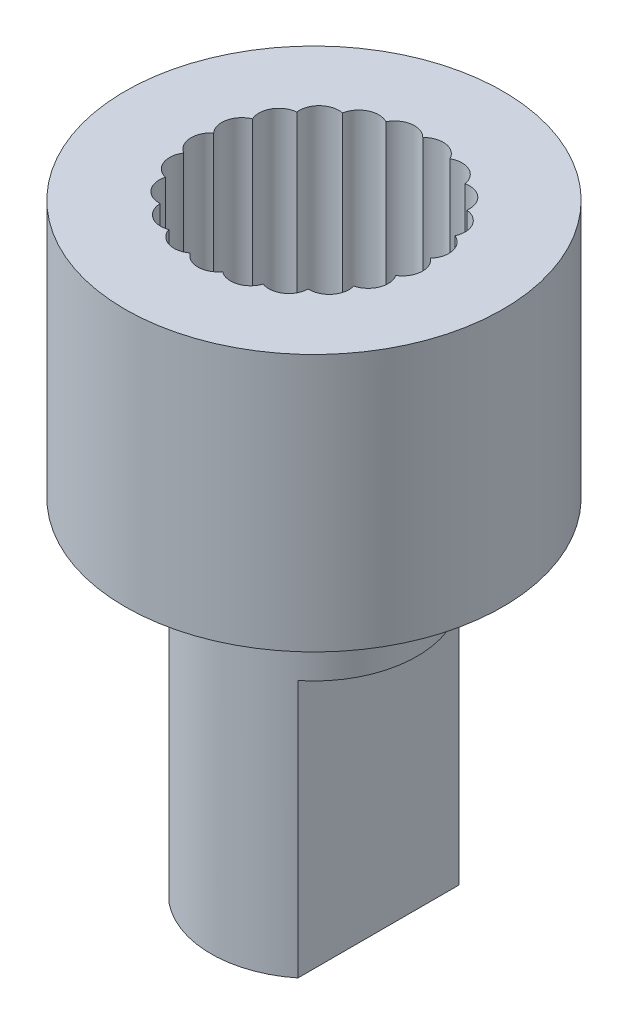
ISO-10303-21;
HEADER;
FILE_DESCRIPTION(('STEP AP214'),'2;1');
FILE_NAME('part.step','',(''),(''),'','','');
FILE_SCHEMA(('AUTOMOTIVE_DESIGN { 1 0 10303 214 1 1 1 1 }'));
ENDSEC;
DATA;
#1=APPLICATION_CONTEXT('core data for automotive mechanical design processes');
#2=APPLICATION_PROTOCOL_DEFINITION('international standard','automotive_design',2000,#1);
#3=PRODUCT_CONTEXT('',#1,'mechanical');
#4=PRODUCT('Part','Part','',(#3));
#5=PRODUCT_RELATED_PRODUCT_CATEGORY('part','',(#4));
#6=PRODUCT_DEFINITION_FORMATION('','',#4);
#7=PRODUCT_DEFINITION_CONTEXT('part definition',#1,'design');
#8=PRODUCT_DEFINITION('design','',#6,#7);
#9=PRODUCT_DEFINITION_SHAPE('','',#8);
#10=(LENGTH_UNIT() NAMED_UNIT(*) SI_UNIT(.MILLI.,.METRE.));
#11=(NAMED_UNIT(*) PLANE_ANGLE_UNIT() SI_UNIT($,.RADIAN.));
#12=(NAMED_UNIT(*) SI_UNIT($,.STERADIAN.) SOLID_ANGLE_UNIT());
#13=UNCERTAINTY_MEASURE_WITH_UNIT(LENGTH_MEASURE(1.E-05),#10,'distance_accuracy_value','');
#14=(GEOMETRIC_REPRESENTATION_CONTEXT(3) GLOBAL_UNCERTAINTY_ASSIGNED_CONTEXT((#13)) GLOBAL_UNIT_ASSIGNED_CONTEXT((#10,
#11,#12)) REPRESENTATION_CONTEXT('',''));
#15=CARTESIAN_POINT('',(0.,0.,0.));
#16=DIRECTION('',(0.,0.,1.));
#17=DIRECTION('',(1.,0.,0.));
#18=AXIS2_PLACEMENT_3D('',#15,#16,#17);
#19=CARTESIAN_POINT('',(0.,-4.,0.));
#20=DIRECTION('',(0.,-1.,0.));
#21=DIRECTION('',(0.,0.,-1.));
#22=AXIS2_PLACEMENT_3D('',#19,#20,#21);
#23=PLANE('',#22);
#24=CARTESIAN_POINT('',(0.,-4.,0.));
#25=DIRECTION('',(0.,-1.,0.));
#26=DIRECTION('',(0.,0.,-1.));
#27=AXIS2_PLACEMENT_3D('',#24,#25,#26);
#28=CIRCLE('',#27,2.4);
#29=CARTESIAN_POINT('',(1.5,-4.,-1.87349939951952));
#30=VERTEX_POINT('',#29);
#31=CARTESIAN_POINT('',(1.5,-4.,1.87349939951952));
#32=VERTEX_POINT('',#31);
#33=EDGE_CURVE('E483',#30,#32,#28,.T.);
#34=ORIENTED_EDGE('',*,*,#33,.T.);
#35=DIRECTION('',(0.,0.,-1.));
#36=VECTOR('',#35,1.);
#37=CARTESIAN_POINT('',(1.5,-4.,0.));
#38=LINE('',#37,#36);
#39=EDGE_CURVE('E450',#32,#30,#38,.T.);
#40=ORIENTED_EDGE('',*,*,#39,.T.);
#41=EDGE_LOOP('',(#34,#40));
#42=FACE_BOUND('',#41,.T.);
#43=ADVANCED_FACE('F41',(#42),#23,.T.);
#44=CARTESIAN_POINT('',(0.,-2.,0.));
#45=DIRECTION('',(0.,1.,0.));
#46=DIRECTION('',(0.,0.,1.));
#47=AXIS2_PLACEMENT_3D('',#44,#45,#46);
#48=CYLINDRICAL_SURFACE('',#47,4.4);
#49=CARTESIAN_POINT('',(0.,-2.,0.));
#50=DIRECTION('',(0.,-1.,0.));
#51=DIRECTION('',(0.,0.,-1.));
#52=AXIS2_PLACEMENT_3D('',#49,#50,#51);
#53=CIRCLE('',#52,4.4);
#54=CARTESIAN_POINT('',(0.,-2.,-4.4));
#55=VERTEX_POINT('',#54);
#56=EDGE_CURVE('E45',#55,#55,#53,.T.);
#57=ORIENTED_EDGE('',*,*,#56,.F.);
#58=EDGE_LOOP('',(#57));
#59=FACE_BOUND('',#58,.T.);
#60=CARTESIAN_POINT('',(0.,4.,0.));
#61=DIRECTION('',(0.,1.,0.));
#62=DIRECTION('',(0.,0.,1.));
#63=AXIS2_PLACEMENT_3D('',#60,#61,#62);
#64=CIRCLE('',#63,4.4);
#65=CARTESIAN_POINT('',(0.,4.,4.4));
#66=VERTEX_POINT('',#65);
#67=EDGE_CURVE('E390',#66,#66,#64,.T.);
#68=ORIENTED_EDGE('',*,*,#67,.F.);
#69=EDGE_LOOP('',(#68));
#70=FACE_BOUND('',#69,.T.);
#71=ADVANCED_FACE('F510',(#59,#70),#48,.T.);
#72=CARTESIAN_POINT('',(0.,-2.,0.));
#73=DIRECTION('',(0.,-1.,0.));
#74=DIRECTION('',(0.,0.,-1.));
#75=AXIS2_PLACEMENT_3D('',#72,#73,#74);
#76=PLANE('',#75);
#77=CARTESIAN_POINT('',(0.,-2.,0.));
#78=DIRECTION('',(0.,-1.,0.));
#79=DIRECTION('',(0.,0.,-1.));
#80=AXIS2_PLACEMENT_3D('',#77,#78,#79);
#81=CIRCLE('',#80,2.4);
#82=CARTESIAN_POINT('',(0.,-2.,-2.4));
#83=VERTEX_POINT('',#82);
#84=EDGE_CURVE('E11',#83,#83,#81,.T.);
#85=ORIENTED_EDGE('',*,*,#84,.F.);
#86=EDGE_LOOP('',(#85));
#87=FACE_BOUND('',#86,.T.);
#88=ORIENTED_EDGE('',*,*,#56,.T.);
#89=EDGE_LOOP('',(#88));
#90=FACE_BOUND('',#89,.T.);
#91=ADVANCED_FACE('F515',(#87,#90),#76,.T.);
#92=CARTESIAN_POINT('',(0.,-4.,0.));
#93=DIRECTION('',(0.,1.,0.));
#94=DIRECTION('',(0.,0.,1.));
#95=AXIS2_PLACEMENT_3D('',#92,#93,#94);
#96=CYLINDRICAL_SURFACE('',#95,2.4);
#97=ORIENTED_EDGE('',*,*,#33,.F.);
#98=DIRECTION('',(0.,1.,0.));
#99=VECTOR('',#98,1.);
#100=CARTESIAN_POINT('',(1.5,-10.,-1.87349939951952));
#101=LINE('',#100,#99);
#102=CARTESIAN_POINT('',(1.5,-10.,-1.87349939951952));
#103=VERTEX_POINT('',#102);
#104=EDGE_CURVE('E466',#103,#30,#101,.T.);
#105=ORIENTED_EDGE('',*,*,#104,.F.);
#106=CARTESIAN_POINT('',(0.,-10.,0.));
#107=DIRECTION('',(0.,-1.,0.));
#108=DIRECTION('',(0.,0.,-1.));
#109=AXIS2_PLACEMENT_3D('',#106,#107,#108);
#110=CIRCLE('',#109,2.4);
#111=CARTESIAN_POINT('',(-1.5,-10.,-1.87349939951952));
#112=VERTEX_POINT('',#111);
#113=EDGE_CURVE('E459',#112,#103,#110,.T.);
#114=ORIENTED_EDGE('',*,*,#113,.F.);
#115=DIRECTION('',(0.,1.,0.));
#116=VECTOR('',#115,1.);
#117=CARTESIAN_POINT('',(-1.5,-10.,-1.87349939951952));
#118=LINE('',#117,#116);
#119=CARTESIAN_POINT('',(-1.5,-4.,-1.87349939951952));
#120=VERTEX_POINT('',#119);
#121=EDGE_CURVE('E470',#112,#120,#118,.T.);
#122=ORIENTED_EDGE('',*,*,#121,.T.);
#123=CARTESIAN_POINT('',(-1.5,-4.,1.87349939951952));
#124=VERTEX_POINT('',#123);
#125=EDGE_CURVE('E482',#124,#120,#28,.T.);
#126=ORIENTED_EDGE('',*,*,#125,.F.);
#127=DIRECTION('',(0.,1.,0.));
#128=VECTOR('',#127,1.);
#129=CARTESIAN_POINT('',(-1.5,-10.,1.87349939951952));
#130=LINE('',#129,#128);
#131=CARTESIAN_POINT('',(-1.5,-10.,1.87349939951952));
#132=VERTEX_POINT('',#131);
#133=EDGE_CURVE('E474',#132,#124,#130,.T.);
#134=ORIENTED_EDGE('',*,*,#133,.F.);
#135=CARTESIAN_POINT('',(1.5,-10.,1.87349939951952));
#136=VERTEX_POINT('',#135);
#137=EDGE_CURVE('E455',#136,#132,#110,.T.);
#138=ORIENTED_EDGE('',*,*,#137,.F.);
#139=DIRECTION('',(0.,1.,0.));
#140=VECTOR('',#139,1.);
#141=CARTESIAN_POINT('',(1.5,-10.,1.87349939951952));
#142=LINE('',#141,#140);
#143=EDGE_CURVE('E478',#136,#32,#142,.T.);
#144=ORIENTED_EDGE('',*,*,#143,.T.);
#145=EDGE_LOOP('',(#97,#105,#114,#122,#126,#134,#138,#144));
#146=FACE_BOUND('',#145,.T.);
#147=ORIENTED_EDGE('',*,*,#84,.T.);
#148=EDGE_LOOP('',(#147));
#149=FACE_BOUND('',#148,.T.);
#150=ADVANCED_FACE('F498',(#146,#149),#96,.T.);
#151=DIRECTION('',(0.,0.,-1.));
#152=VECTOR('',#151,1.);
#153=CARTESIAN_POINT('',(-1.5,-4.,0.));
#154=LINE('',#153,#152);
#155=EDGE_CURVE('E64',#124,#120,#154,.T.);
#156=ORIENTED_EDGE('',*,*,#155,.F.);
#157=ORIENTED_EDGE('',*,*,#125,.T.);
#158=EDGE_LOOP('',(#156,#157));
#159=FACE_BOUND('',#158,.T.);
#160=ADVANCED_FACE('F490',(#159),#23,.T.);
#161=CARTESIAN_POINT('',(1.5,-10.,0.));
#162=DIRECTION('',(1.,0.,0.));
#163=DIRECTION('',(0.,0.,-1.));
#164=AXIS2_PLACEMENT_3D('',#161,#162,#163);
#165=PLANE('',#164);
#166=ORIENTED_EDGE('',*,*,#39,.F.);
#167=ORIENTED_EDGE('',*,*,#143,.F.);
#168=DIRECTION('',(0.,0.,-1.));
#169=VECTOR('',#168,1.);
#170=CARTESIAN_POINT('',(1.5,-10.,0.));
#171=LINE('',#170,#169);
#172=EDGE_CURVE('E451',#136,#103,#171,.T.);
#173=ORIENTED_EDGE('',*,*,#172,.T.);
#174=ORIENTED_EDGE('',*,*,#104,.T.);
#175=EDGE_LOOP('',(#166,#167,#173,#174));
#176=FACE_BOUND('',#175,.T.);
#177=ADVANCED_FACE('F508',(#176),#165,.T.);
#178=CARTESIAN_POINT('',(-1.5,-10.,0.));
#179=DIRECTION('',(1.,0.,0.));
#180=DIRECTION('',(0.,0.,-1.));
#181=AXIS2_PLACEMENT_3D('',#178,#179,#180);
#182=PLANE('',#181);
#183=ORIENTED_EDGE('',*,*,#155,.T.);
#184=ORIENTED_EDGE('',*,*,#121,.F.);
#185=DIRECTION('',(0.,0.,-1.));
#186=VECTOR('',#185,1.);
#187=CARTESIAN_POINT('',(-1.5,-10.,0.));
#188=LINE('',#187,#186);
#189=EDGE_CURVE('E458',#132,#112,#188,.T.);
#190=ORIENTED_EDGE('',*,*,#189,.F.);
#191=ORIENTED_EDGE('',*,*,#133,.T.);
#192=EDGE_LOOP('',(#183,#184,#190,#191));
#193=FACE_BOUND('',#192,.T.);
#194=ADVANCED_FACE('F495',(#193),#182,.F.);
#195=CARTESIAN_POINT('',(0.,-10.,0.));
#196=DIRECTION('',(0.,-1.,0.));
#197=DIRECTION('',(0.,0.,-1.));
#198=AXIS2_PLACEMENT_3D('',#195,#196,#197);
#199=PLANE('',#198);
#200=ORIENTED_EDGE('',*,*,#172,.F.);
#201=ORIENTED_EDGE('',*,*,#137,.T.);
#202=ORIENTED_EDGE('',*,*,#189,.T.);
#203=ORIENTED_EDGE('',*,*,#113,.T.);
#204=EDGE_LOOP('',(#200,#201,#202,#203));
#205=FACE_BOUND('',#204,.T.);
#206=ADVANCED_FACE('F504',(#205),#199,.T.);
#207=CARTESIAN_POINT('',(0.,4.,0.));
#208=DIRECTION('',(0.,1.,0.));
#209=DIRECTION('',(0.,0.,1.));
#210=AXIS2_PLACEMENT_3D('',#207,#208,#209);
#211=PLANE('',#210);
#212=CARTESIAN_POINT('',(2.18016592774031,4.,-0.497608646094468));
#213=DIRECTION('',(0.,1.,0.));
#214=DIRECTION('',(0.,0.,1.));
#215=AXIS2_PLACEMENT_3D('',#212,#213,#214);
#216=CIRCLE('',#215,0.463767043184508);
#217=CARTESIAN_POINT('',(2.52665455787561,4.,-0.189346583019778));
#218=VERTEX_POINT('',#217);
#219=CARTESIAN_POINT('',(2.35859150001944,4.,-0.925678950484961));
#220=VERTEX_POINT('',#219);
#221=EDGE_CURVE('E57',#218,#220,#216,.T.);
#222=ORIENTED_EDGE('',*,*,#221,.F.);
#223=CARTESIAN_POINT('',(2.2299799959181,4.,0.167113898143874));
#224=DIRECTION('',(0.,1.,0.));
#225=DIRECTION('',(0.,0.,1.));
#226=AXIS2_PLACEMENT_3D('',#223,#224,#225);
#227=CIRCLE('',#226,0.463767043184508);
#228=CARTESIAN_POINT('',(2.47021327022364,4.,0.563810059280507));
#229=VERTEX_POINT('',#228);
#230=EDGE_CURVE('E233',#229,#218,#227,.T.);
#231=ORIENTED_EDGE('',*,*,#230,.F.);
#232=CARTESIAN_POINT('',(2.08165055535255,4.,0.816987639164871));
#233=DIRECTION('',(0.,1.,0.));
#234=DIRECTION('',(0.,0.,1.));
#235=AXIS2_PLACEMENT_3D('',#232,#233,#234);
#236=CIRCLE('',#235,0.463767043184508);
#237=CARTESIAN_POINT('',(2.19428269315992,4.,1.26686970357403));
#238=VERTEX_POINT('',#237);
#239=EDGE_CURVE('E237',#238,#229,#236,.T.);
#240=ORIENTED_EDGE('',*,*,#239,.F.);
#241=CARTESIAN_POINT('',(1.74835732777092,4.,1.39426844315487));
#242=DIRECTION('',(0.,1.,0.));
#243=DIRECTION('',(0.,0.,1.));
#244=AXIS2_PLACEMENT_3D('',#241,#242,#243);
#245=CIRCLE('',#244,0.463767043184509);
#246=CARTESIAN_POINT('',(1.72338046935794,4.,1.85736241513887));
#247=VERTEX_POINT('',#246);
#248=EDGE_CURVE('E380',#247,#238,#245,.T.);
#249=ORIENTED_EDGE('',*,*,#248,.F.);
#250=CARTESIAN_POINT('',(1.25971487907708,4.,1.84766237732427));
#251=DIRECTION('',(0.,1.,0.));
#252=DIRECTION('',(0.,0.,1.));
#253=AXIS2_PLACEMENT_3D('',#250,#251,#252);
#254=CIRCLE('',#253,0.463767043184508);
#255=CARTESIAN_POINT('',(1.09934832792289,4.,2.28282032521792));
#256=VERTEX_POINT('',#255);
#257=EDGE_CURVE('E376',#256,#247,#254,.T.);
#258=ORIENTED_EDGE('',*,*,#257,.F.);
#259=CARTESIAN_POINT('',(0.659141235209555,4.,2.13688340093562));
#260=DIRECTION('',(0.,1.,0.));
#261=DIRECTION('',(0.,0.,1.));
#262=AXIS2_PLACEMENT_3D('',#259,#260,#261);
#263=CIRCLE('',#262,0.463767043184508);
#264=CARTESIAN_POINT('',(0.377634263141212,4.,2.50543963140936));
#265=VERTEX_POINT('',#264);
#266=EDGE_CURVE('E372',#265,#256,#263,.T.);
#267=ORIENTED_EDGE('',*,*,#266,.F.);
#268=CARTESIAN_POINT('',(0.,4.,2.2362329568155));
#269=DIRECTION('',(0.,1.,0.));
#270=DIRECTION('',(0.,0.,1.));
#271=AXIS2_PLACEMENT_3D('',#268,#269,#270);
#272=CIRCLE('',#271,0.463767043184508);
#273=CARTESIAN_POINT('',(-0.377634263141229,4.,2.50543963140936));
#274=VERTEX_POINT('',#273);
#275=EDGE_CURVE('E368',#274,#265,#272,.T.);
#276=ORIENTED_EDGE('',*,*,#275,.F.);
#277=CARTESIAN_POINT('',(-0.659141235209571,4.,2.13688340093562));
#278=DIRECTION('',(0.,1.,0.));
#279=DIRECTION('',(0.,0.,1.));
#280=AXIS2_PLACEMENT_3D('',#277,#278,#279);
#281=CIRCLE('',#280,0.463767043184508);
#282=CARTESIAN_POINT('',(-1.0993483279229,4.,2.28282032521791));
#283=VERTEX_POINT('',#282);
#284=EDGE_CURVE('E364',#283,#274,#281,.T.);
#285=ORIENTED_EDGE('',*,*,#284,.F.);
#286=CARTESIAN_POINT('',(-1.2597148790771,4.,1.84766237732427));
#287=DIRECTION('',(0.,1.,0.));
#288=DIRECTION('',(0.,0.,1.));
#289=AXIS2_PLACEMENT_3D('',#286,#287,#288);
#290=CIRCLE('',#289,0.463767043184508);
#291=CARTESIAN_POINT('',(-1.72338046935796,4.,1.85736241513886));
#292=VERTEX_POINT('',#291);
#293=EDGE_CURVE('E360',#292,#283,#290,.T.);
#294=ORIENTED_EDGE('',*,*,#293,.F.);
#295=CARTESIAN_POINT('',(-1.74835732777093,4.,1.39426844315486));
#296=DIRECTION('',(0.,1.,0.));
#297=DIRECTION('',(0.,0.,1.));
#298=AXIS2_PLACEMENT_3D('',#295,#296,#297);
#299=CIRCLE('',#298,0.463767043184508);
#300=CARTESIAN_POINT('',(-2.19428269315993,4.,1.26686970357402));
#301=VERTEX_POINT('',#300);
#302=EDGE_CURVE('E356',#301,#292,#299,.T.);
#303=ORIENTED_EDGE('',*,*,#302,.F.);
#304=CARTESIAN_POINT('',(-2.08165055535256,4.,0.816987639164863));
#305=DIRECTION('',(0.,1.,0.));
#306=DIRECTION('',(0.,0.,1.));
#307=AXIS2_PLACEMENT_3D('',#304,#305,#306);
#308=CIRCLE('',#307,0.463767043184509);
#309=CARTESIAN_POINT('',(-2.47021327022365,4.,0.563810059280497));
#310=VERTEX_POINT('',#309);
#311=EDGE_CURVE('E352',#310,#301,#308,.T.);
#312=ORIENTED_EDGE('',*,*,#311,.F.);
#313=CARTESIAN_POINT('',(-2.22997999591811,4.,0.167113898143865));
#314=DIRECTION('',(0.,1.,0.));
#315=DIRECTION('',(0.,0.,1.));
#316=AXIS2_PLACEMENT_3D('',#313,#314,#315);
#317=CIRCLE('',#316,0.463767043184508);
#318=CARTESIAN_POINT('',(-2.52665455787562,4.,-0.189346583019788));
#319=VERTEX_POINT('',#318);
#320=EDGE_CURVE('E348',#319,#310,#317,.T.);
#321=ORIENTED_EDGE('',*,*,#320,.F.);
#322=CARTESIAN_POINT('',(-2.18016592774032,4.,-0.497608646094477));
#323=DIRECTION('',(0.,1.,0.));
#324=DIRECTION('',(0.,0.,1.));
#325=AXIS2_PLACEMENT_3D('',#322,#323,#324);
#326=CIRCLE('',#325,0.463767043184508);
#327=CARTESIAN_POINT('',(-2.35859150001942,4.,-0.925678950484978));
#328=VERTEX_POINT('',#327);
#329=EDGE_CURVE('E344',#328,#319,#326,.T.);
#330=ORIENTED_EDGE('',*,*,#329,.F.);
#331=CARTESIAN_POINT('',(-1.93663454938219,4.,-1.11811647840777));
#332=DIRECTION('',(0.,1.,0.));
#333=DIRECTION('',(0.,0.,1.));
#334=AXIS2_PLACEMENT_3D('',#331,#332,#333);
#335=CIRCLE('',#334,0.463767043184513);
#336=CARTESIAN_POINT('',(-1.9809572368782,4.,-1.57976068092442));
#337=VERTEX_POINT('',#336);
#338=EDGE_CURVE('E340',#337,#328,#335,.T.);
#339=ORIENTED_EDGE('',*,*,#338,.F.);
#340=CARTESIAN_POINT('',(-1.52102469253073,4.,-1.63927475484116));
#341=DIRECTION('',(0.,1.,0.));
#342=DIRECTION('',(0.,0.,1.));
#343=AXIS2_PLACEMENT_3D('',#340,#341,#342);
#344=CIRCLE('',#343,0.463767043184508);
#345=CARTESIAN_POINT('',(-1.42730622995269,4.,-2.09347374219815));
#346=VERTEX_POINT('',#345);
#347=EDGE_CURVE('E336',#346,#337,#344,.T.);
#348=ORIENTED_EDGE('',*,*,#347,.F.);
#349=CARTESIAN_POINT('',(-0.970265116840991,4.,-2.01477627546815));
#350=DIRECTION('',(0.,1.,0.));
#351=DIRECTION('',(0.,0.,1.));
#352=AXIS2_PLACEMENT_3D('',#349,#350,#351);
#353=CIRCLE('',#352,0.463767043184509);
#354=CARTESIAN_POINT('',(-0.746832800865689,4.,-2.42117247441939));
#355=VERTEX_POINT('',#354);
#356=EDGE_CURVE('E332',#355,#346,#353,.T.);
#357=ORIENTED_EDGE('',*,*,#356,.F.);
#358=CARTESIAN_POINT('',(-0.333293227581628,4.,-2.21125608231973));
#359=DIRECTION('',(0.,1.,0.));
#360=DIRECTION('',(0.,0.,1.));
#361=AXIS2_PLACEMENT_3D('',#358,#359,#360);
#362=CIRCLE('',#361,0.463767043184508);
#363=CARTESIAN_POINT('',(0.,4.,-2.53373940714804));
#364=VERTEX_POINT('',#363);
#365=EDGE_CURVE('E328',#364,#355,#362,.T.);
#366=ORIENTED_EDGE('',*,*,#365,.F.);
#367=CARTESIAN_POINT('',(0.33329322758163,4.,-2.21125608231973));
#368=DIRECTION('',(0.,1.,0.));
#369=DIRECTION('',(0.,0.,1.));
#370=AXIS2_PLACEMENT_3D('',#367,#368,#369);
#371=CIRCLE('',#370,0.463767043184508);
#372=CARTESIAN_POINT('',(0.746832800865703,4.,-2.42117247441936));
#373=VERTEX_POINT('',#372);
#374=EDGE_CURVE('E324',#373,#364,#371,.T.);
#375=ORIENTED_EDGE('',*,*,#374,.F.);
#376=CARTESIAN_POINT('',(0.970265116841022,4.,-2.01477627546813));
#377=DIRECTION('',(0.,1.,0.));
#378=DIRECTION('',(0.,0.,1.));
#379=AXIS2_PLACEMENT_3D('',#376,#377,#378);
#380=CIRCLE('',#379,0.463767043184508);
#381=CARTESIAN_POINT('',(1.42730622995272,4.,-2.09347374219813));
#382=VERTEX_POINT('',#381);
#383=EDGE_CURVE('E320',#382,#373,#380,.T.);
#384=ORIENTED_EDGE('',*,*,#383,.F.);
#385=CARTESIAN_POINT('',(1.52102469253075,4.,-1.63927475484114));
#386=DIRECTION('',(0.,1.,0.));
#387=DIRECTION('',(0.,0.,1.));
#388=AXIS2_PLACEMENT_3D('',#385,#386,#387);
#389=CIRCLE('',#388,0.463767043184509);
#390=CARTESIAN_POINT('',(1.98095723687822,4.,-1.57976068092439));
#391=VERTEX_POINT('',#390);
#392=EDGE_CURVE('E316',#391,#382,#389,.T.);
#393=ORIENTED_EDGE('',*,*,#392,.F.);
#394=CARTESIAN_POINT('',(1.93663454938221,4.,-1.11811647840774));
#395=DIRECTION('',(0.,1.,0.));
#396=DIRECTION('',(0.,0.,1.));
#397=AXIS2_PLACEMENT_3D('',#394,#395,#396);
#398=CIRCLE('',#397,0.463767043184508);
#399=EDGE_CURVE('E313',#220,#391,#398,.T.);
#400=ORIENTED_EDGE('',*,*,#399,.F.);
#401=EDGE_LOOP('',(#222,#231,#240,#249,#258,#267,#276,#285,#294,#303,#312,#321,#330,#339,#348,
#357,#366,#375,#384,#393,#400));
#402=FACE_BOUND('',#401,.T.);
#403=ORIENTED_EDGE('',*,*,#67,.T.);
#404=EDGE_LOOP('',(#403));
#405=FACE_BOUND('',#404,.T.);
#406=ADVANCED_FACE('F43',(#402,#405),#211,.T.);
#407=CARTESIAN_POINT('',(2.18016592774031,0.,-0.497608646094468));
#408=DIRECTION('',(0.,1.,0.));
#409=DIRECTION('',(0.,0.,1.));
#410=AXIS2_PLACEMENT_3D('',#407,#408,#409);
#411=CYLINDRICAL_SURFACE('',#410,0.463767043184508);
#412=ORIENTED_EDGE('',*,*,#221,.T.);
#413=DIRECTION('',(0.,1.,0.));
#414=VECTOR('',#413,1.);
#415=CARTESIAN_POINT('',(2.35859150001944,0.,-0.925678950484961));
#416=LINE('',#415,#414);
#417=CARTESIAN_POINT('',(2.35859150001944,0.,-0.925678950484961));
#418=VERTEX_POINT('',#417);
#419=EDGE_CURVE('E207',#418,#220,#416,.T.);
#420=ORIENTED_EDGE('',*,*,#419,.F.);
#421=CARTESIAN_POINT('',(2.18016592774031,0.,-0.497608646094468));
#422=DIRECTION('',(0.,1.,0.));
#423=DIRECTION('',(0.,0.,1.));
#424=AXIS2_PLACEMENT_3D('',#421,#422,#423);
#425=CIRCLE('',#424,0.463767043184508);
#426=CARTESIAN_POINT('',(2.52665455787561,0.,-0.189346583019778));
#427=VERTEX_POINT('',#426);
#428=EDGE_CURVE('E211',#427,#418,#425,.T.);
#429=ORIENTED_EDGE('',*,*,#428,.F.);
#430=DIRECTION('',(0.,1.,0.));
#431=VECTOR('',#430,1.);
#432=CARTESIAN_POINT('',(2.52665455787561,0.,-0.189346583019778));
#433=LINE('',#432,#431);
#434=EDGE_CURVE('E387',#427,#218,#433,.T.);
#435=ORIENTED_EDGE('',*,*,#434,.T.);
#436=EDGE_LOOP('',(#412,#420,#429,#435));
#437=FACE_BOUND('',#436,.T.);
#438=ADVANCED_FACE('F209',(#437),#411,.F.);
#439=CARTESIAN_POINT('',(2.2299799959181,0.,0.167113898143874));
#440=DIRECTION('',(0.,1.,0.));
#441=DIRECTION('',(0.,0.,1.));
#442=AXIS2_PLACEMENT_3D('',#439,#440,#441);
#443=CYLINDRICAL_SURFACE('',#442,0.463767043184508);
#444=ORIENTED_EDGE('',*,*,#230,.T.);
#445=ORIENTED_EDGE('',*,*,#434,.F.);
#446=CARTESIAN_POINT('',(2.2299799959181,0.,0.167113898143874));
#447=DIRECTION('',(0.,1.,0.));
#448=DIRECTION('',(0.,0.,1.));
#449=AXIS2_PLACEMENT_3D('',#446,#447,#448);
#450=CIRCLE('',#449,0.463767043184508);
#451=CARTESIAN_POINT('',(2.47021327022364,0.,0.563810059280507));
#452=VERTEX_POINT('',#451);
#453=EDGE_CURVE('E218',#452,#427,#450,.T.);
#454=ORIENTED_EDGE('',*,*,#453,.F.);
#455=DIRECTION('',(0.,1.,0.));
#456=VECTOR('',#455,1.);
#457=CARTESIAN_POINT('',(2.47021327022364,0.,0.563810059280507));
#458=LINE('',#457,#456);
#459=EDGE_CURVE('E391',#452,#229,#458,.T.);
#460=ORIENTED_EDGE('',*,*,#459,.T.);
#461=EDGE_LOOP('',(#444,#445,#454,#460));
#462=FACE_BOUND('',#461,.T.);
#463=ADVANCED_FACE('F546',(#462),#443,.F.);
#464=CARTESIAN_POINT('',(2.08165055535255,0.,0.816987639164871));
#465=DIRECTION('',(0.,1.,0.));
#466=DIRECTION('',(0.,0.,1.));
#467=AXIS2_PLACEMENT_3D('',#464,#465,#466);
#468=CYLINDRICAL_SURFACE('',#467,0.463767043184508);
#469=ORIENTED_EDGE('',*,*,#239,.T.);
#470=ORIENTED_EDGE('',*,*,#459,.F.);
#471=CARTESIAN_POINT('',(2.08165055535255,0.,0.816987639164871));
#472=DIRECTION('',(0.,1.,0.));
#473=DIRECTION('',(0.,0.,1.));
#474=AXIS2_PLACEMENT_3D('',#471,#472,#473);
#475=CIRCLE('',#474,0.463767043184508);
#476=CARTESIAN_POINT('',(2.19428269315992,0.,1.26686970357403));
#477=VERTEX_POINT('',#476);
#478=EDGE_CURVE('E306',#477,#452,#475,.T.);
#479=ORIENTED_EDGE('',*,*,#478,.F.);
#480=DIRECTION('',(0.,1.,0.));
#481=VECTOR('',#480,1.);
#482=CARTESIAN_POINT('',(2.19428269315992,0.,1.26686970357403));
#483=LINE('',#482,#481);
#484=EDGE_CURVE('E394',#477,#238,#483,.T.);
#485=ORIENTED_EDGE('',*,*,#484,.T.);
#486=EDGE_LOOP('',(#469,#470,#479,#485));
#487=FACE_BOUND('',#486,.T.);
#488=ADVANCED_FACE('F575',(#487),#468,.F.);
#489=CARTESIAN_POINT('',(1.74835732777092,0.,1.39426844315487));
#490=DIRECTION('',(0.,1.,0.));
#491=DIRECTION('',(0.,0.,1.));
#492=AXIS2_PLACEMENT_3D('',#489,#490,#491);
#493=CYLINDRICAL_SURFACE('',#492,0.463767043184509);
#494=ORIENTED_EDGE('',*,*,#248,.T.);
#495=ORIENTED_EDGE('',*,*,#484,.F.);
#496=CARTESIAN_POINT('',(1.74835732777092,0.,1.39426844315487));
#497=DIRECTION('',(0.,1.,0.));
#498=DIRECTION('',(0.,0.,1.));
#499=AXIS2_PLACEMENT_3D('',#496,#497,#498);
#500=CIRCLE('',#499,0.463767043184509);
#501=CARTESIAN_POINT('',(1.72338046935794,0.,1.85736241513887));
#502=VERTEX_POINT('',#501);
#503=EDGE_CURVE('E302',#502,#477,#500,.T.);
#504=ORIENTED_EDGE('',*,*,#503,.F.);
#505=DIRECTION('',(0.,1.,0.));
#506=VECTOR('',#505,1.);
#507=CARTESIAN_POINT('',(1.72338046935794,0.,1.85736241513887));
#508=LINE('',#507,#506);
#509=EDGE_CURVE('E397',#502,#247,#508,.T.);
#510=ORIENTED_EDGE('',*,*,#509,.T.);
#511=EDGE_LOOP('',(#494,#495,#504,#510));
#512=FACE_BOUND('',#511,.T.);
#513=ADVANCED_FACE('F583',(#512),#493,.F.);
#514=CARTESIAN_POINT('',(1.25971487907708,0.,1.84766237732427));
#515=DIRECTION('',(0.,1.,0.));
#516=DIRECTION('',(0.,0.,1.));
#517=AXIS2_PLACEMENT_3D('',#514,#515,#516);
#518=CYLINDRICAL_SURFACE('',#517,0.463767043184508);
#519=ORIENTED_EDGE('',*,*,#257,.T.);
#520=ORIENTED_EDGE('',*,*,#509,.F.);
#521=CARTESIAN_POINT('',(1.25971487907708,0.,1.84766237732427));
#522=DIRECTION('',(0.,1.,0.));
#523=DIRECTION('',(0.,0.,1.));
#524=AXIS2_PLACEMENT_3D('',#521,#522,#523);
#525=CIRCLE('',#524,0.463767043184508);
#526=CARTESIAN_POINT('',(1.09934832792289,0.,2.28282032521792));
#527=VERTEX_POINT('',#526);
#528=EDGE_CURVE('E298',#527,#502,#525,.T.);
#529=ORIENTED_EDGE('',*,*,#528,.F.);
#530=DIRECTION('',(0.,1.,0.));
#531=VECTOR('',#530,1.);
#532=CARTESIAN_POINT('',(1.09934832792289,0.,2.28282032521792));
#533=LINE('',#532,#531);
#534=EDGE_CURVE('E400',#527,#256,#533,.T.);
#535=ORIENTED_EDGE('',*,*,#534,.T.);
#536=EDGE_LOOP('',(#519,#520,#529,#535));
#537=FACE_BOUND('',#536,.T.);
#538=ADVANCED_FACE('F591',(#537),#518,.F.);
#539=CARTESIAN_POINT('',(0.659141235209555,0.,2.13688340093562));
#540=DIRECTION('',(0.,1.,0.));
#541=DIRECTION('',(0.,0.,1.));
#542=AXIS2_PLACEMENT_3D('',#539,#540,#541);
#543=CYLINDRICAL_SURFACE('',#542,0.463767043184508);
#544=ORIENTED_EDGE('',*,*,#266,.T.);
#545=ORIENTED_EDGE('',*,*,#534,.F.);
#546=CARTESIAN_POINT('',(0.659141235209555,0.,2.13688340093562));
#547=DIRECTION('',(0.,1.,0.));
#548=DIRECTION('',(0.,0.,1.));
#549=AXIS2_PLACEMENT_3D('',#546,#547,#548);
#550=CIRCLE('',#549,0.463767043184508);
#551=CARTESIAN_POINT('',(0.377634263141212,0.,2.50543963140936));
#552=VERTEX_POINT('',#551);
#553=EDGE_CURVE('E294',#552,#527,#550,.T.);
#554=ORIENTED_EDGE('',*,*,#553,.F.);
#555=DIRECTION('',(0.,1.,0.));
#556=VECTOR('',#555,1.);
#557=CARTESIAN_POINT('',(0.377634263141212,0.,2.50543963140936));
#558=LINE('',#557,#556);
#559=EDGE_CURVE('E403',#552,#265,#558,.T.);
#560=ORIENTED_EDGE('',*,*,#559,.T.);
#561=EDGE_LOOP('',(#544,#545,#554,#560));
#562=FACE_BOUND('',#561,.T.);
#563=ADVANCED_FACE('F599',(#562),#543,.F.);
#564=CARTESIAN_POINT('',(0.,0.,2.2362329568155));
#565=DIRECTION('',(0.,1.,0.));
#566=DIRECTION('',(0.,0.,1.));
#567=AXIS2_PLACEMENT_3D('',#564,#565,#566);
#568=CYLINDRICAL_SURFACE('',#567,0.463767043184508);
#569=ORIENTED_EDGE('',*,*,#275,.T.);
#570=ORIENTED_EDGE('',*,*,#559,.F.);
#571=CARTESIAN_POINT('',(0.,0.,2.2362329568155));
#572=DIRECTION('',(0.,1.,0.));
#573=DIRECTION('',(0.,0.,1.));
#574=AXIS2_PLACEMENT_3D('',#571,#572,#573);
#575=CIRCLE('',#574,0.463767043184508);
#576=CARTESIAN_POINT('',(-0.377634263141229,0.,2.50543963140936));
#577=VERTEX_POINT('',#576);
#578=EDGE_CURVE('E290',#577,#552,#575,.T.);
#579=ORIENTED_EDGE('',*,*,#578,.F.);
#580=DIRECTION('',(0.,1.,0.));
#581=VECTOR('',#580,1.);
#582=CARTESIAN_POINT('',(-0.377634263141229,0.,2.50543963140936));
#583=LINE('',#582,#581);
#584=EDGE_CURVE('E406',#577,#274,#583,.T.);
#585=ORIENTED_EDGE('',*,*,#584,.T.);
#586=EDGE_LOOP('',(#569,#570,#579,#585));
#587=FACE_BOUND('',#586,.T.);
#588=ADVANCED_FACE('F607',(#587),#568,.F.);
#589=CARTESIAN_POINT('',(-0.659141235209571,0.,2.13688340093562));
#590=DIRECTION('',(0.,1.,0.));
#591=DIRECTION('',(0.,0.,1.));
#592=AXIS2_PLACEMENT_3D('',#589,#590,#591);
#593=CYLINDRICAL_SURFACE('',#592,0.463767043184508);
#594=ORIENTED_EDGE('',*,*,#284,.T.);
#595=ORIENTED_EDGE('',*,*,#584,.F.);
#596=CARTESIAN_POINT('',(-0.659141235209571,0.,2.13688340093562));
#597=DIRECTION('',(0.,1.,0.));
#598=DIRECTION('',(0.,0.,1.));
#599=AXIS2_PLACEMENT_3D('',#596,#597,#598);
#600=CIRCLE('',#599,0.463767043184508);
#601=CARTESIAN_POINT('',(-1.0993483279229,0.,2.28282032521791));
#602=VERTEX_POINT('',#601);
#603=EDGE_CURVE('E286',#602,#577,#600,.T.);
#604=ORIENTED_EDGE('',*,*,#603,.F.);
#605=DIRECTION('',(0.,1.,0.));
#606=VECTOR('',#605,1.);
#607=CARTESIAN_POINT('',(-1.0993483279229,0.,2.28282032521791));
#608=LINE('',#607,#606);
#609=EDGE_CURVE('E409',#602,#283,#608,.T.);
#610=ORIENTED_EDGE('',*,*,#609,.T.);
#611=EDGE_LOOP('',(#594,#595,#604,#610));
#612=FACE_BOUND('',#611,.T.);
#613=ADVANCED_FACE('F615',(#612),#593,.F.);
#614=CARTESIAN_POINT('',(-1.2597148790771,0.,1.84766237732427));
#615=DIRECTION('',(0.,1.,0.));
#616=DIRECTION('',(0.,0.,1.));
#617=AXIS2_PLACEMENT_3D('',#614,#615,#616);
#618=CYLINDRICAL_SURFACE('',#617,0.463767043184508);
#619=ORIENTED_EDGE('',*,*,#293,.T.);
#620=ORIENTED_EDGE('',*,*,#609,.F.);
#621=CARTESIAN_POINT('',(-1.2597148790771,0.,1.84766237732427));
#622=DIRECTION('',(0.,1.,0.));
#623=DIRECTION('',(0.,0.,1.));
#624=AXIS2_PLACEMENT_3D('',#621,#622,#623);
#625=CIRCLE('',#624,0.463767043184508);
#626=CARTESIAN_POINT('',(-1.72338046935796,0.,1.85736241513886));
#627=VERTEX_POINT('',#626);
#628=EDGE_CURVE('E282',#627,#602,#625,.T.);
#629=ORIENTED_EDGE('',*,*,#628,.F.);
#630=DIRECTION('',(0.,1.,0.));
#631=VECTOR('',#630,1.);
#632=CARTESIAN_POINT('',(-1.72338046935796,0.,1.85736241513886));
#633=LINE('',#632,#631);
#634=EDGE_CURVE('E412',#627,#292,#633,.T.);
#635=ORIENTED_EDGE('',*,*,#634,.T.);
#636=EDGE_LOOP('',(#619,#620,#629,#635));
#637=FACE_BOUND('',#636,.T.);
#638=ADVANCED_FACE('F623',(#637),#618,.F.);
#639=CARTESIAN_POINT('',(-1.74835732777093,0.,1.39426844315486));
#640=DIRECTION('',(0.,1.,0.));
#641=DIRECTION('',(0.,0.,1.));
#642=AXIS2_PLACEMENT_3D('',#639,#640,#641);
#643=CYLINDRICAL_SURFACE('',#642,0.463767043184508);
#644=ORIENTED_EDGE('',*,*,#302,.T.);
#645=ORIENTED_EDGE('',*,*,#634,.F.);
#646=CARTESIAN_POINT('',(-1.74835732777093,0.,1.39426844315486));
#647=DIRECTION('',(0.,1.,0.));
#648=DIRECTION('',(0.,0.,1.));
#649=AXIS2_PLACEMENT_3D('',#646,#647,#648);
#650=CIRCLE('',#649,0.463767043184508);
#651=CARTESIAN_POINT('',(-2.19428269315993,0.,1.26686970357402));
#652=VERTEX_POINT('',#651);
#653=EDGE_CURVE('E278',#652,#627,#650,.T.);
#654=ORIENTED_EDGE('',*,*,#653,.F.);
#655=DIRECTION('',(0.,1.,0.));
#656=VECTOR('',#655,1.);
#657=CARTESIAN_POINT('',(-2.19428269315993,0.,1.26686970357402));
#658=LINE('',#657,#656);
#659=EDGE_CURVE('E415',#652,#301,#658,.T.);
#660=ORIENTED_EDGE('',*,*,#659,.T.);
#661=EDGE_LOOP('',(#644,#645,#654,#660));
#662=FACE_BOUND('',#661,.T.);
#663=ADVANCED_FACE('F631',(#662),#643,.F.);
#664=CARTESIAN_POINT('',(-2.08165055535256,0.,0.816987639164863));
#665=DIRECTION('',(0.,1.,0.));
#666=DIRECTION('',(0.,0.,1.));
#667=AXIS2_PLACEMENT_3D('',#664,#665,#666);
#668=CYLINDRICAL_SURFACE('',#667,0.463767043184509);
#669=ORIENTED_EDGE('',*,*,#311,.T.);
#670=ORIENTED_EDGE('',*,*,#659,.F.);
#671=CARTESIAN_POINT('',(-2.08165055535256,0.,0.816987639164863));
#672=DIRECTION('',(0.,1.,0.));
#673=DIRECTION('',(0.,0.,1.));
#674=AXIS2_PLACEMENT_3D('',#671,#672,#673);
#675=CIRCLE('',#674,0.463767043184509);
#676=CARTESIAN_POINT('',(-2.47021327022365,0.,0.563810059280497));
#677=VERTEX_POINT('',#676);
#678=EDGE_CURVE('E274',#677,#652,#675,.T.);
#679=ORIENTED_EDGE('',*,*,#678,.F.);
#680=DIRECTION('',(0.,1.,0.));
#681=VECTOR('',#680,1.);
#682=CARTESIAN_POINT('',(-2.47021327022365,0.,0.563810059280497));
#683=LINE('',#682,#681);
#684=EDGE_CURVE('E418',#677,#310,#683,.T.);
#685=ORIENTED_EDGE('',*,*,#684,.T.);
#686=EDGE_LOOP('',(#669,#670,#679,#685));
#687=FACE_BOUND('',#686,.T.);
#688=ADVANCED_FACE('F639',(#687),#668,.F.);
#689=CARTESIAN_POINT('',(-2.22997999591811,0.,0.167113898143865));
#690=DIRECTION('',(0.,1.,0.));
#691=DIRECTION('',(0.,0.,1.));
#692=AXIS2_PLACEMENT_3D('',#689,#690,#691);
#693=CYLINDRICAL_SURFACE('',#692,0.463767043184508);
#694=ORIENTED_EDGE('',*,*,#320,.T.);
#695=ORIENTED_EDGE('',*,*,#684,.F.);
#696=CARTESIAN_POINT('',(-2.22997999591811,0.,0.167113898143865));
#697=DIRECTION('',(0.,1.,0.));
#698=DIRECTION('',(0.,0.,1.));
#699=AXIS2_PLACEMENT_3D('',#696,#697,#698);
#700=CIRCLE('',#699,0.463767043184508);
#701=CARTESIAN_POINT('',(-2.52665455787562,0.,-0.189346583019788));
#702=VERTEX_POINT('',#701);
#703=EDGE_CURVE('E270',#702,#677,#700,.T.);
#704=ORIENTED_EDGE('',*,*,#703,.F.);
#705=DIRECTION('',(0.,1.,0.));
#706=VECTOR('',#705,1.);
#707=CARTESIAN_POINT('',(-2.52665455787562,0.,-0.189346583019788));
#708=LINE('',#707,#706);
#709=EDGE_CURVE('E421',#702,#319,#708,.T.);
#710=ORIENTED_EDGE('',*,*,#709,.T.);
#711=EDGE_LOOP('',(#694,#695,#704,#710));
#712=FACE_BOUND('',#711,.T.);
#713=ADVANCED_FACE('F647',(#712),#693,.F.);
#714=CARTESIAN_POINT('',(-2.18016592774032,0.,-0.497608646094477));
#715=DIRECTION('',(0.,1.,0.));
#716=DIRECTION('',(0.,0.,1.));
#717=AXIS2_PLACEMENT_3D('',#714,#715,#716);
#718=CYLINDRICAL_SURFACE('',#717,0.463767043184508);
#719=ORIENTED_EDGE('',*,*,#329,.T.);
#720=ORIENTED_EDGE('',*,*,#709,.F.);
#721=CARTESIAN_POINT('',(-2.18016592774032,0.,-0.497608646094477));
#722=DIRECTION('',(0.,1.,0.));
#723=DIRECTION('',(0.,0.,1.));
#724=AXIS2_PLACEMENT_3D('',#721,#722,#723);
#725=CIRCLE('',#724,0.463767043184508);
#726=CARTESIAN_POINT('',(-2.35859150001942,0.,-0.925678950484978));
#727=VERTEX_POINT('',#726);
#728=EDGE_CURVE('E266',#727,#702,#725,.T.);
#729=ORIENTED_EDGE('',*,*,#728,.F.);
#730=DIRECTION('',(0.,1.,0.));
#731=VECTOR('',#730,1.);
#732=CARTESIAN_POINT('',(-2.35859150001942,0.,-0.925678950484978));
#733=LINE('',#732,#731);
#734=EDGE_CURVE('E424',#727,#328,#733,.T.);
#735=ORIENTED_EDGE('',*,*,#734,.T.);
#736=EDGE_LOOP('',(#719,#720,#729,#735));
#737=FACE_BOUND('',#736,.T.);
#738=ADVANCED_FACE('F655',(#737),#718,.F.);
#739=CARTESIAN_POINT('',(-1.93663454938219,0.,-1.11811647840777));
#740=DIRECTION('',(0.,1.,0.));
#741=DIRECTION('',(0.,0.,1.));
#742=AXIS2_PLACEMENT_3D('',#739,#740,#741);
#743=CYLINDRICAL_SURFACE('',#742,0.463767043184513);
#744=ORIENTED_EDGE('',*,*,#338,.T.);
#745=ORIENTED_EDGE('',*,*,#734,.F.);
#746=CARTESIAN_POINT('',(-1.93663454938219,0.,-1.11811647840777));
#747=DIRECTION('',(0.,1.,0.));
#748=DIRECTION('',(0.,0.,1.));
#749=AXIS2_PLACEMENT_3D('',#746,#747,#748);
#750=CIRCLE('',#749,0.463767043184513);
#751=CARTESIAN_POINT('',(-1.9809572368782,0.,-1.57976068092442));
#752=VERTEX_POINT('',#751);
#753=EDGE_CURVE('E262',#752,#727,#750,.T.);
#754=ORIENTED_EDGE('',*,*,#753,.F.);
#755=DIRECTION('',(0.,1.,0.));
#756=VECTOR('',#755,1.);
#757=CARTESIAN_POINT('',(-1.9809572368782,0.,-1.57976068092442));
#758=LINE('',#757,#756);
#759=EDGE_CURVE('E427',#752,#337,#758,.T.);
#760=ORIENTED_EDGE('',*,*,#759,.T.);
#761=EDGE_LOOP('',(#744,#745,#754,#760));
#762=FACE_BOUND('',#761,.T.);
#763=ADVANCED_FACE('F663',(#762),#743,.F.);
#764=CARTESIAN_POINT('',(-1.52102469253073,0.,-1.63927475484116));
#765=DIRECTION('',(0.,1.,0.));
#766=DIRECTION('',(0.,0.,1.));
#767=AXIS2_PLACEMENT_3D('',#764,#765,#766);
#768=CYLINDRICAL_SURFACE('',#767,0.463767043184508);
#769=ORIENTED_EDGE('',*,*,#347,.T.);
#770=ORIENTED_EDGE('',*,*,#759,.F.);
#771=CARTESIAN_POINT('',(-1.52102469253073,0.,-1.63927475484116));
#772=DIRECTION('',(0.,1.,0.));
#773=DIRECTION('',(0.,0.,1.));
#774=AXIS2_PLACEMENT_3D('',#771,#772,#773);
#775=CIRCLE('',#774,0.463767043184508);
#776=CARTESIAN_POINT('',(-1.42730622995269,0.,-2.09347374219815));
#777=VERTEX_POINT('',#776);
#778=EDGE_CURVE('E258',#777,#752,#775,.T.);
#779=ORIENTED_EDGE('',*,*,#778,.F.);
#780=DIRECTION('',(0.,1.,0.));
#781=VECTOR('',#780,1.);
#782=CARTESIAN_POINT('',(-1.42730622995269,0.,-2.09347374219815));
#783=LINE('',#782,#781);
#784=EDGE_CURVE('E430',#777,#346,#783,.T.);
#785=ORIENTED_EDGE('',*,*,#784,.T.);
#786=EDGE_LOOP('',(#769,#770,#779,#785));
#787=FACE_BOUND('',#786,.T.);
#788=ADVANCED_FACE('F671',(#787),#768,.F.);
#789=CARTESIAN_POINT('',(-0.970265116840991,0.,-2.01477627546815));
#790=DIRECTION('',(0.,1.,0.));
#791=DIRECTION('',(0.,0.,1.));
#792=AXIS2_PLACEMENT_3D('',#789,#790,#791);
#793=CYLINDRICAL_SURFACE('',#792,0.463767043184509);
#794=ORIENTED_EDGE('',*,*,#356,.T.);
#795=ORIENTED_EDGE('',*,*,#784,.F.);
#796=CARTESIAN_POINT('',(-0.970265116840991,0.,-2.01477627546815));
#797=DIRECTION('',(0.,1.,0.));
#798=DIRECTION('',(0.,0.,1.));
#799=AXIS2_PLACEMENT_3D('',#796,#797,#798);
#800=CIRCLE('',#799,0.463767043184509);
#801=CARTESIAN_POINT('',(-0.746832800865689,0.,-2.42117247441939));
#802=VERTEX_POINT('',#801);
#803=EDGE_CURVE('E254',#802,#777,#800,.T.);
#804=ORIENTED_EDGE('',*,*,#803,.F.);
#805=DIRECTION('',(0.,1.,0.));
#806=VECTOR('',#805,1.);
#807=CARTESIAN_POINT('',(-0.746832800865689,0.,-2.42117247441939));
#808=LINE('',#807,#806);
#809=EDGE_CURVE('E433',#802,#355,#808,.T.);
#810=ORIENTED_EDGE('',*,*,#809,.T.);
#811=EDGE_LOOP('',(#794,#795,#804,#810));
#812=FACE_BOUND('',#811,.T.);
#813=ADVANCED_FACE('F679',(#812),#793,.F.);
#814=CARTESIAN_POINT('',(-0.333293227581628,0.,-2.21125608231973));
#815=DIRECTION('',(0.,1.,0.));
#816=DIRECTION('',(0.,0.,1.));
#817=AXIS2_PLACEMENT_3D('',#814,#815,#816);
#818=CYLINDRICAL_SURFACE('',#817,0.463767043184508);
#819=ORIENTED_EDGE('',*,*,#365,.T.);
#820=ORIENTED_EDGE('',*,*,#809,.F.);
#821=CARTESIAN_POINT('',(-0.333293227581628,0.,-2.21125608231973));
#822=DIRECTION('',(0.,1.,0.));
#823=DIRECTION('',(0.,0.,1.));
#824=AXIS2_PLACEMENT_3D('',#821,#822,#823);
#825=CIRCLE('',#824,0.463767043184508);
#826=CARTESIAN_POINT('',(0.,0.,-2.53373940714804));
#827=VERTEX_POINT('',#826);
#828=EDGE_CURVE('E250',#827,#802,#825,.T.);
#829=ORIENTED_EDGE('',*,*,#828,.F.);
#830=DIRECTION('',(0.,1.,0.));
#831=VECTOR('',#830,1.);
#832=CARTESIAN_POINT('',(0.,0.,-2.53373940714804));
#833=LINE('',#832,#831);
#834=EDGE_CURVE('E436',#827,#364,#833,.T.);
#835=ORIENTED_EDGE('',*,*,#834,.T.);
#836=EDGE_LOOP('',(#819,#820,#829,#835));
#837=FACE_BOUND('',#836,.T.);
#838=ADVANCED_FACE('F687',(#837),#818,.F.);
#839=CARTESIAN_POINT('',(0.33329322758163,0.,-2.21125608231973));
#840=DIRECTION('',(0.,1.,0.));
#841=DIRECTION('',(0.,0.,1.));
#842=AXIS2_PLACEMENT_3D('',#839,#840,#841);
#843=CYLINDRICAL_SURFACE('',#842,0.463767043184508);
#844=ORIENTED_EDGE('',*,*,#374,.T.);
#845=ORIENTED_EDGE('',*,*,#834,.F.);
#846=CARTESIAN_POINT('',(0.33329322758163,0.,-2.21125608231973));
#847=DIRECTION('',(0.,1.,0.));
#848=DIRECTION('',(0.,0.,1.));
#849=AXIS2_PLACEMENT_3D('',#846,#847,#848);
#850=CIRCLE('',#849,0.463767043184508);
#851=CARTESIAN_POINT('',(0.746832800865703,0.,-2.42117247441936));
#852=VERTEX_POINT('',#851);
#853=EDGE_CURVE('E246',#852,#827,#850,.T.);
#854=ORIENTED_EDGE('',*,*,#853,.F.);
#855=DIRECTION('',(0.,1.,0.));
#856=VECTOR('',#855,1.);
#857=CARTESIAN_POINT('',(0.746832800865703,0.,-2.42117247441936));
#858=LINE('',#857,#856);
#859=EDGE_CURVE('E439',#852,#373,#858,.T.);
#860=ORIENTED_EDGE('',*,*,#859,.T.);
#861=EDGE_LOOP('',(#844,#845,#854,#860));
#862=FACE_BOUND('',#861,.T.);
#863=ADVANCED_FACE('F695',(#862),#843,.F.);
#864=CARTESIAN_POINT('',(0.970265116841022,0.,-2.01477627546813));
#865=DIRECTION('',(0.,1.,0.));
#866=DIRECTION('',(0.,0.,1.));
#867=AXIS2_PLACEMENT_3D('',#864,#865,#866);
#868=CYLINDRICAL_SURFACE('',#867,0.463767043184508);
#869=ORIENTED_EDGE('',*,*,#383,.T.);
#870=ORIENTED_EDGE('',*,*,#859,.F.);
#871=CARTESIAN_POINT('',(0.970265116841022,0.,-2.01477627546813));
#872=DIRECTION('',(0.,1.,0.));
#873=DIRECTION('',(0.,0.,1.));
#874=AXIS2_PLACEMENT_3D('',#871,#872,#873);
#875=CIRCLE('',#874,0.463767043184508);
#876=CARTESIAN_POINT('',(1.42730622995272,0.,-2.09347374219813));
#877=VERTEX_POINT('',#876);
#878=EDGE_CURVE('E242',#877,#852,#875,.T.);
#879=ORIENTED_EDGE('',*,*,#878,.F.);
#880=DIRECTION('',(0.,1.,0.));
#881=VECTOR('',#880,1.);
#882=CARTESIAN_POINT('',(1.42730622995272,0.,-2.09347374219813));
#883=LINE('',#882,#881);
#884=EDGE_CURVE('E442',#877,#382,#883,.T.);
#885=ORIENTED_EDGE('',*,*,#884,.T.);
#886=EDGE_LOOP('',(#869,#870,#879,#885));
#887=FACE_BOUND('',#886,.T.);
#888=ADVANCED_FACE('F539',(#887),#868,.F.);
#889=CARTESIAN_POINT('',(1.52102469253075,0.,-1.63927475484114));
#890=DIRECTION('',(0.,1.,0.));
#891=DIRECTION('',(0.,0.,1.));
#892=AXIS2_PLACEMENT_3D('',#889,#890,#891);
#893=CYLINDRICAL_SURFACE('',#892,0.463767043184509);
#894=ORIENTED_EDGE('',*,*,#392,.T.);
#895=ORIENTED_EDGE('',*,*,#884,.F.);
#896=CARTESIAN_POINT('',(1.52102469253075,0.,-1.63927475484114));
#897=DIRECTION('',(0.,1.,0.));
#898=DIRECTION('',(0.,0.,1.));
#899=AXIS2_PLACEMENT_3D('',#896,#897,#898);
#900=CIRCLE('',#899,0.463767043184509);
#901=CARTESIAN_POINT('',(1.98095723687822,0.,-1.57976068092439));
#902=VERTEX_POINT('',#901);
#903=EDGE_CURVE('E227',#902,#877,#900,.T.);
#904=ORIENTED_EDGE('',*,*,#903,.F.);
#905=DIRECTION('',(0.,1.,0.));
#906=VECTOR('',#905,1.);
#907=CARTESIAN_POINT('',(1.98095723687822,0.,-1.57976068092439));
#908=LINE('',#907,#906);
#909=EDGE_CURVE('E217',#902,#391,#908,.T.);
#910=ORIENTED_EDGE('',*,*,#909,.T.);
#911=EDGE_LOOP('',(#894,#895,#904,#910));
#912=FACE_BOUND('',#911,.T.);
#913=ADVANCED_FACE('F534',(#912),#893,.F.);
#914=CARTESIAN_POINT('',(1.93663454938221,0.,-1.11811647840774));
#915=DIRECTION('',(0.,1.,0.));
#916=DIRECTION('',(0.,0.,1.));
#917=AXIS2_PLACEMENT_3D('',#914,#915,#916);
#918=CYLINDRICAL_SURFACE('',#917,0.463767043184508);
#919=ORIENTED_EDGE('',*,*,#399,.T.);
#920=ORIENTED_EDGE('',*,*,#909,.F.);
#921=CARTESIAN_POINT('',(1.93663454938221,0.,-1.11811647840774));
#922=DIRECTION('',(0.,1.,0.));
#923=DIRECTION('',(0.,0.,1.));
#924=AXIS2_PLACEMENT_3D('',#921,#922,#923);
#925=CIRCLE('',#924,0.463767043184508);
#926=EDGE_CURVE('E221',#418,#902,#925,.T.);
#927=ORIENTED_EDGE('',*,*,#926,.F.);
#928=ORIENTED_EDGE('',*,*,#419,.T.);
#929=EDGE_LOOP('',(#919,#920,#927,#928));
#930=FACE_BOUND('',#929,.T.);
#931=ADVANCED_FACE('F222',(#930),#918,.F.);
#932=CARTESIAN_POINT('',(0.,0.,0.));
#933=DIRECTION('',(0.,-1.,0.));
#934=DIRECTION('',(0.,0.,-1.));
#935=AXIS2_PLACEMENT_3D('',#932,#933,#934);
#936=PLANE('',#935);
#937=ORIENTED_EDGE('',*,*,#428,.T.);
#938=ORIENTED_EDGE('',*,*,#926,.T.);
#939=ORIENTED_EDGE('',*,*,#903,.T.);
#940=ORIENTED_EDGE('',*,*,#878,.T.);
#941=ORIENTED_EDGE('',*,*,#853,.T.);
#942=ORIENTED_EDGE('',*,*,#828,.T.);
#943=ORIENTED_EDGE('',*,*,#803,.T.);
#944=ORIENTED_EDGE('',*,*,#778,.T.);
#945=ORIENTED_EDGE('',*,*,#753,.T.);
#946=ORIENTED_EDGE('',*,*,#728,.T.);
#947=ORIENTED_EDGE('',*,*,#703,.T.);
#948=ORIENTED_EDGE('',*,*,#678,.T.);
#949=ORIENTED_EDGE('',*,*,#653,.T.);
#950=ORIENTED_EDGE('',*,*,#628,.T.);
#951=ORIENTED_EDGE('',*,*,#603,.T.);
#952=ORIENTED_EDGE('',*,*,#578,.T.);
#953=ORIENTED_EDGE('',*,*,#553,.T.);
#954=ORIENTED_EDGE('',*,*,#528,.T.);
#955=ORIENTED_EDGE('',*,*,#503,.T.);
#956=ORIENTED_EDGE('',*,*,#478,.T.);
#957=ORIENTED_EDGE('',*,*,#453,.T.);
#958=EDGE_LOOP('',(#937,#938,#939,#940,#941,#942,#943,#944,#945,#946,#947,#948,#949,#950,#951,
#952,#953,#954,#955,#956,#957));
#959=FACE_BOUND('',#958,.T.);
#960=ADVANCED_FACE('F229',(#959),#936,.F.);
#961=CLOSED_SHELL('',(#43,#71,#91,#150,#160,#177,#194,#206,#406,#438,#463,#488,#513,#538,#563,
#588,#613,#638,#663,#688,#713,#738,#763,#788,#813,#838,#863,#888,#913,#931,#960));
#962=MANIFOLD_SOLID_BREP('B2',#961);
#963=ADVANCED_BREP_SHAPE_REPRESENTATION('',(#18,#962),#14);
#964=SHAPE_DEFINITION_REPRESENTATION(#9,#963);
ENDSEC;
END-ISO-10303-21;
